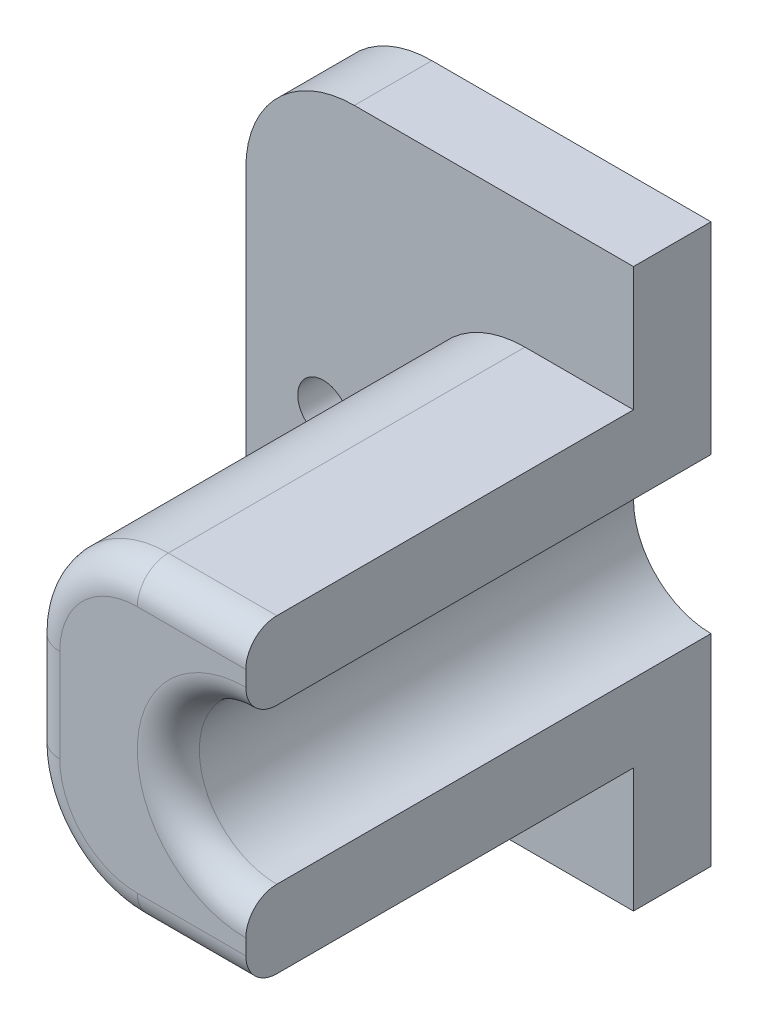
ISO-10303-21;
HEADER;
FILE_DESCRIPTION(('STEP AP214'),'2;1');
FILE_NAME('part.step','',(''),(''),'','','');
FILE_SCHEMA(('AUTOMOTIVE_DESIGN { 1 0 10303 214 1 1 1 1 }'));
ENDSEC;
DATA;
#1=APPLICATION_CONTEXT('core data for automotive mechanical design processes');
#2=APPLICATION_PROTOCOL_DEFINITION('international standard','automotive_design',2000,#1);
#3=PRODUCT_CONTEXT('',#1,'mechanical');
#4=PRODUCT('Part','Part','',(#3));
#5=PRODUCT_RELATED_PRODUCT_CATEGORY('part','',(#4));
#6=PRODUCT_DEFINITION_FORMATION('','',#4);
#7=PRODUCT_DEFINITION_CONTEXT('part definition',#1,'design');
#8=PRODUCT_DEFINITION('design','',#6,#7);
#9=PRODUCT_DEFINITION_SHAPE('','',#8);
#10=(LENGTH_UNIT() NAMED_UNIT(*) SI_UNIT(.MILLI.,.METRE.));
#11=(NAMED_UNIT(*) PLANE_ANGLE_UNIT() SI_UNIT($,.RADIAN.));
#12=(NAMED_UNIT(*) SI_UNIT($,.STERADIAN.) SOLID_ANGLE_UNIT());
#13=UNCERTAINTY_MEASURE_WITH_UNIT(LENGTH_MEASURE(1.E-05),#10,'distance_accuracy_value','');
#14=(GEOMETRIC_REPRESENTATION_CONTEXT(3) GLOBAL_UNCERTAINTY_ASSIGNED_CONTEXT((#13)) GLOBAL_UNIT_ASSIGNED_CONTEXT((#10,
#11,#12)) REPRESENTATION_CONTEXT('',''));
#15=CARTESIAN_POINT('',(0.,0.,0.));
#16=DIRECTION('',(0.,0.,1.));
#17=DIRECTION('',(1.,0.,0.));
#18=AXIS2_PLACEMENT_3D('',#15,#16,#17);
#19=CARTESIAN_POINT('',(0.,18.,5.));
#20=DIRECTION('',(-1.,0.,0.));
#21=DIRECTION('',(0.,0.,1.));
#22=AXIS2_PLACEMENT_3D('',#19,#20,#21);
#23=PLANE('',#22);
#24=DIRECTION('',(0.,0.,1.));
#25=VECTOR('',#24,1.);
#26=CARTESIAN_POINT('',(0.,-5.,-5.));
#27=LINE('',#26,#25);
#28=CARTESIAN_POINT('',(0.,-5.,0.));
#29=VERTEX_POINT('',#28);
#30=CARTESIAN_POINT('',(0.,-5.,28.));
#31=VERTEX_POINT('',#30);
#32=EDGE_CURVE('E185',#29,#31,#27,.T.);
#33=ORIENTED_EDGE('',*,*,#32,.T.);
#34=CARTESIAN_POINT('',(0.,-7.,28.));
#35=DIRECTION('',(-1.,0.,0.));
#36=DIRECTION('',(0.,0.,1.));
#37=AXIS2_PLACEMENT_3D('',#34,#35,#36);
#38=CIRCLE('',#37,2.);
#39=CARTESIAN_POINT('',(0.,-7.,30.));
#40=VERTEX_POINT('',#39);
#41=EDGE_CURVE('E269',#31,#40,#38,.F.);
#42=ORIENTED_EDGE('',*,*,#41,.T.);
#43=DIRECTION('',(0.,1.,0.));
#44=VECTOR('',#43,1.);
#45=CARTESIAN_POINT('',(0.,10.,30.));
#46=LINE('',#45,#44);
#47=CARTESIAN_POINT('',(0.,-8.,30.));
#48=VERTEX_POINT('',#47);
#49=EDGE_CURVE('E333',#48,#40,#46,.T.);
#50=ORIENTED_EDGE('',*,*,#49,.F.);
#51=CARTESIAN_POINT('',(0.,-8.,28.));
#52=DIRECTION('',(-1.,0.,0.));
#53=DIRECTION('',(0.,0.,1.));
#54=AXIS2_PLACEMENT_3D('',#51,#52,#53);
#55=CIRCLE('',#54,2.);
#56=CARTESIAN_POINT('',(0.,-10.,28.));
#57=VERTEX_POINT('',#56);
#58=EDGE_CURVE('E266',#48,#57,#55,.F.);
#59=ORIENTED_EDGE('',*,*,#58,.T.);
#60=DIRECTION('',(0.,0.,-1.));
#61=VECTOR('',#60,1.);
#62=CARTESIAN_POINT('',(0.,-10.,30.));
#63=LINE('',#62,#61);
#64=CARTESIAN_POINT('',(0.,-10.,5.));
#65=VERTEX_POINT('',#64);
#66=EDGE_CURVE('E342',#57,#65,#63,.T.);
#67=ORIENTED_EDGE('',*,*,#66,.T.);
#68=DIRECTION('',(0.,1.,0.));
#69=VECTOR('',#68,1.);
#70=CARTESIAN_POINT('',(0.,18.,5.));
#71=LINE('',#70,#69);
#72=CARTESIAN_POINT('',(0.,-18.,5.));
#73=VERTEX_POINT('',#72);
#74=EDGE_CURVE('E376',#73,#65,#71,.T.);
#75=ORIENTED_EDGE('',*,*,#74,.F.);
#76=DIRECTION('',(0.,0.,-1.));
#77=VECTOR('',#76,1.);
#78=CARTESIAN_POINT('',(0.,-18.,5.));
#79=LINE('',#78,#77);
#80=CARTESIAN_POINT('',(0.,-18.,0.));
#81=VERTEX_POINT('',#80);
#82=EDGE_CURVE('E213',#73,#81,#79,.T.);
#83=ORIENTED_EDGE('',*,*,#82,.T.);
#84=DIRECTION('',(0.,1.,0.));
#85=VECTOR('',#84,1.);
#86=CARTESIAN_POINT('',(0.,18.,0.));
#87=LINE('',#86,#85);
#88=EDGE_CURVE('E198',#81,#29,#87,.T.);
#89=ORIENTED_EDGE('',*,*,#88,.T.);
#90=EDGE_LOOP('',(#33,#42,#50,#59,#67,#75,#83,#89));
#91=FACE_BOUND('',#90,.T.);
#92=ADVANCED_FACE('F40',(#91),#23,.F.);
#93=CARTESIAN_POINT('',(0.,0.,5.));
#94=DIRECTION('',(0.,0.,1.));
#95=DIRECTION('',(1.,0.,0.));
#96=AXIS2_PLACEMENT_3D('',#93,#94,#95);
#97=PLANE('',#96);
#98=DIRECTION('',(0.,-1.,0.));
#99=VECTOR('',#98,1.);
#100=CARTESIAN_POINT('',(-25.,18.,5.));
#101=LINE('',#100,#99);
#102=CARTESIAN_POINT('',(-25.,11.,5.));
#103=VERTEX_POINT('',#102);
#104=CARTESIAN_POINT('',(-25.,-11.,5.));
#105=VERTEX_POINT('',#104);
#106=EDGE_CURVE('E209',#103,#105,#101,.T.);
#107=ORIENTED_EDGE('',*,*,#106,.T.);
#108=CARTESIAN_POINT('',(-18.,-11.,5.));
#109=DIRECTION('',(0.,0.,1.));
#110=DIRECTION('',(1.,0.,0.));
#111=AXIS2_PLACEMENT_3D('',#108,#109,#110);
#112=CIRCLE('',#111,7.);
#113=CARTESIAN_POINT('',(-18.,-18.,5.));
#114=VERTEX_POINT('',#113);
#115=EDGE_CURVE('E260',#105,#114,#112,.T.);
#116=ORIENTED_EDGE('',*,*,#115,.T.);
#117=DIRECTION('',(1.,0.,0.));
#118=VECTOR('',#117,1.);
#119=CARTESIAN_POINT('',(-25.,-18.,5.));
#120=LINE('',#119,#118);
#121=EDGE_CURVE('E372',#114,#73,#120,.T.);
#122=ORIENTED_EDGE('',*,*,#121,.T.);
#123=ORIENTED_EDGE('',*,*,#74,.T.);
#124=DIRECTION('',(1.,0.,0.));
#125=VECTOR('',#124,1.);
#126=CARTESIAN_POINT('',(-14.,-10.,5.));
#127=LINE('',#126,#125);
#128=CARTESIAN_POINT('',(-6.99999999999999,-10.,5.));
#129=VERTEX_POINT('',#128);
#130=EDGE_CURVE('E352',#129,#65,#127,.T.);
#131=ORIENTED_EDGE('',*,*,#130,.F.);
#132=CARTESIAN_POINT('',(-6.99999999999999,-3.,5.));
#133=DIRECTION('',(0.,0.,1.));
#134=DIRECTION('',(1.,0.,0.));
#135=AXIS2_PLACEMENT_3D('',#132,#133,#134);
#136=CIRCLE('',#135,7.);
#137=CARTESIAN_POINT('',(-14.,-3.,5.));
#138=VERTEX_POINT('',#137);
#139=EDGE_CURVE('E234',#129,#138,#136,.F.);
#140=ORIENTED_EDGE('',*,*,#139,.T.);
#141=DIRECTION('',(0.,-1.,0.));
#142=VECTOR('',#141,1.);
#143=CARTESIAN_POINT('',(-14.,10.,5.));
#144=LINE('',#143,#142);
#145=CARTESIAN_POINT('',(-14.,3.,5.));
#146=VERTEX_POINT('',#145);
#147=EDGE_CURVE('E348',#146,#138,#144,.T.);
#148=ORIENTED_EDGE('',*,*,#147,.F.);
#149=CARTESIAN_POINT('',(-6.99999999999999,3.,5.));
#150=DIRECTION('',(0.,0.,1.));
#151=DIRECTION('',(1.,0.,0.));
#152=AXIS2_PLACEMENT_3D('',#149,#150,#151);
#153=CIRCLE('',#152,7.);
#154=CARTESIAN_POINT('',(-6.99999999999999,10.,5.));
#155=VERTEX_POINT('',#154);
#156=EDGE_CURVE('E225',#146,#155,#153,.F.);
#157=ORIENTED_EDGE('',*,*,#156,.T.);
#158=DIRECTION('',(-1.,0.,0.));
#159=VECTOR('',#158,1.);
#160=CARTESIAN_POINT('',(-14.,10.,5.));
#161=LINE('',#160,#159);
#162=CARTESIAN_POINT('',(0.,10.,5.));
#163=VERTEX_POINT('',#162);
#164=EDGE_CURVE('E345',#163,#155,#161,.T.);
#165=ORIENTED_EDGE('',*,*,#164,.F.);
#166=CARTESIAN_POINT('',(0.,18.,5.));
#167=VERTEX_POINT('',#166);
#168=EDGE_CURVE('E375',#163,#167,#71,.T.);
#169=ORIENTED_EDGE('',*,*,#168,.T.);
#170=DIRECTION('',(-1.,0.,0.));
#171=VECTOR('',#170,1.);
#172=CARTESIAN_POINT('',(-25.,18.,5.));
#173=LINE('',#172,#171);
#174=CARTESIAN_POINT('',(-18.,18.,5.));
#175=VERTEX_POINT('',#174);
#176=EDGE_CURVE('E214',#167,#175,#173,.T.);
#177=ORIENTED_EDGE('',*,*,#176,.T.);
#178=CARTESIAN_POINT('',(-18.,11.,5.));
#179=DIRECTION('',(0.,0.,1.));
#180=DIRECTION('',(1.,0.,0.));
#181=AXIS2_PLACEMENT_3D('',#178,#179,#180);
#182=CIRCLE('',#181,7.);
#183=EDGE_CURVE('E247',#175,#103,#182,.T.);
#184=ORIENTED_EDGE('',*,*,#183,.T.);
#185=EDGE_LOOP('',(#107,#116,#122,#123,#131,#140,#148,#157,#165,#169,#177,#184));
#186=FACE_BOUND('',#185,.T.);
#187=CARTESIAN_POINT('',(-20.,0.,5.));
#188=DIRECTION('',(0.,0.,1.));
#189=DIRECTION('',(1.,0.,0.));
#190=AXIS2_PLACEMENT_3D('',#187,#188,#189);
#191=CIRCLE('',#190,1.65);
#192=CARTESIAN_POINT('',(-18.35,0.,5.));
#193=VERTEX_POINT('',#192);
#194=EDGE_CURVE('E362',#193,#193,#191,.T.);
#195=ORIENTED_EDGE('',*,*,#194,.F.);
#196=EDGE_LOOP('',(#195));
#197=FACE_BOUND('',#196,.T.);
#198=ADVANCED_FACE('F396',(#186,#197),#97,.T.);
#199=CARTESIAN_POINT('',(0.,0.,0.));
#200=DIRECTION('',(0.,0.,1.));
#201=DIRECTION('',(1.,0.,0.));
#202=AXIS2_PLACEMENT_3D('',#199,#200,#201);
#203=PLANE('',#202);
#204=DIRECTION('',(1.,0.,0.));
#205=VECTOR('',#204,1.);
#206=CARTESIAN_POINT('',(-25.,-18.,0.));
#207=LINE('',#206,#205);
#208=CARTESIAN_POINT('',(-18.,-18.,0.));
#209=VERTEX_POINT('',#208);
#210=EDGE_CURVE('E199',#209,#81,#207,.T.);
#211=ORIENTED_EDGE('',*,*,#210,.F.);
#212=CARTESIAN_POINT('',(-18.,-11.,0.));
#213=DIRECTION('',(0.,0.,1.));
#214=DIRECTION('',(1.,0.,0.));
#215=AXIS2_PLACEMENT_3D('',#212,#213,#214);
#216=CIRCLE('',#215,7.);
#217=CARTESIAN_POINT('',(-25.,-11.,0.));
#218=VERTEX_POINT('',#217);
#219=EDGE_CURVE('E254',#209,#218,#216,.F.);
#220=ORIENTED_EDGE('',*,*,#219,.T.);
#221=DIRECTION('',(0.,-1.,0.));
#222=VECTOR('',#221,1.);
#223=CARTESIAN_POINT('',(-25.,18.,0.));
#224=LINE('',#223,#222);
#225=CARTESIAN_POINT('',(-25.,11.,0.));
#226=VERTEX_POINT('',#225);
#227=EDGE_CURVE('E203',#226,#218,#224,.T.);
#228=ORIENTED_EDGE('',*,*,#227,.F.);
#229=CARTESIAN_POINT('',(-18.,11.,0.));
#230=DIRECTION('',(0.,0.,1.));
#231=DIRECTION('',(1.,0.,0.));
#232=AXIS2_PLACEMENT_3D('',#229,#230,#231);
#233=CIRCLE('',#232,7.);
#234=CARTESIAN_POINT('',(-18.,18.,0.));
#235=VERTEX_POINT('',#234);
#236=EDGE_CURVE('E241',#226,#235,#233,.F.);
#237=ORIENTED_EDGE('',*,*,#236,.T.);
#238=DIRECTION('',(-1.,0.,0.));
#239=VECTOR('',#238,1.);
#240=CARTESIAN_POINT('',(-25.,18.,0.));
#241=LINE('',#240,#239);
#242=CARTESIAN_POINT('',(0.,18.,0.));
#243=VERTEX_POINT('',#242);
#244=EDGE_CURVE('E196',#243,#235,#241,.T.);
#245=ORIENTED_EDGE('',*,*,#244,.F.);
#246=CARTESIAN_POINT('',(0.,5.,0.));
#247=VERTEX_POINT('',#246);
#248=EDGE_CURVE('E172',#247,#243,#87,.T.);
#249=ORIENTED_EDGE('',*,*,#248,.F.);
#250=CARTESIAN_POINT('',(0.,0.,0.));
#251=DIRECTION('',(0.,0.,1.));
#252=DIRECTION('',(1.,0.,0.));
#253=AXIS2_PLACEMENT_3D('',#250,#251,#252);
#254=CIRCLE('',#253,5.);
#255=EDGE_CURVE('E180',#247,#29,#254,.T.);
#256=ORIENTED_EDGE('',*,*,#255,.T.);
#257=ORIENTED_EDGE('',*,*,#88,.F.);
#258=EDGE_LOOP('',(#211,#220,#228,#237,#245,#249,#256,#257));
#259=FACE_BOUND('',#258,.T.);
#260=CARTESIAN_POINT('',(-20.,0.,0.));
#261=DIRECTION('',(0.,0.,1.));
#262=DIRECTION('',(1.,0.,0.));
#263=AXIS2_PLACEMENT_3D('',#260,#261,#262);
#264=CIRCLE('',#263,1.65);
#265=CARTESIAN_POINT('',(-18.35,0.,0.));
#266=VERTEX_POINT('',#265);
#267=EDGE_CURVE('E361',#266,#266,#264,.T.);
#268=ORIENTED_EDGE('',*,*,#267,.T.);
#269=EDGE_LOOP('',(#268));
#270=FACE_BOUND('',#269,.T.);
#271=ADVANCED_FACE('F193',(#259,#270),#203,.F.);
#272=CARTESIAN_POINT('',(-25.,18.,5.));
#273=DIRECTION('',(1.,0.,0.));
#274=DIRECTION('',(0.,0.,-1.));
#275=AXIS2_PLACEMENT_3D('',#272,#273,#274);
#276=PLANE('',#275);
#277=ORIENTED_EDGE('',*,*,#227,.T.);
#278=DIRECTION('',(0.,0.,-1.));
#279=VECTOR('',#278,1.);
#280=CARTESIAN_POINT('',(-25.,-11.,5.));
#281=LINE('',#280,#279);
#282=EDGE_CURVE('E257',#218,#105,#281,.F.);
#283=ORIENTED_EDGE('',*,*,#282,.T.);
#284=ORIENTED_EDGE('',*,*,#106,.F.);
#285=DIRECTION('',(0.,0.,-1.));
#286=VECTOR('',#285,1.);
#287=CARTESIAN_POINT('',(-25.,11.,5.));
#288=LINE('',#287,#286);
#289=EDGE_CURVE('E237',#103,#226,#288,.T.);
#290=ORIENTED_EDGE('',*,*,#289,.T.);
#291=EDGE_LOOP('',(#277,#283,#284,#290));
#292=FACE_BOUND('',#291,.T.);
#293=ADVANCED_FACE('F387',(#292),#276,.F.);
#294=CARTESIAN_POINT('',(-25.,-18.,5.));
#295=DIRECTION('',(0.,1.,0.));
#296=DIRECTION('',(0.,0.,1.));
#297=AXIS2_PLACEMENT_3D('',#294,#295,#296);
#298=PLANE('',#297);
#299=ORIENTED_EDGE('',*,*,#121,.F.);
#300=DIRECTION('',(0.,0.,-1.));
#301=VECTOR('',#300,1.);
#302=CARTESIAN_POINT('',(-18.,-18.,5.));
#303=LINE('',#302,#301);
#304=EDGE_CURVE('E250',#114,#209,#303,.T.);
#305=ORIENTED_EDGE('',*,*,#304,.T.);
#306=ORIENTED_EDGE('',*,*,#210,.T.);
#307=ORIENTED_EDGE('',*,*,#82,.F.);
#308=EDGE_LOOP('',(#299,#305,#306,#307));
#309=FACE_BOUND('',#308,.T.);
#310=ADVANCED_FACE('F400',(#309),#298,.F.);
#311=CARTESIAN_POINT('',(0.,7.,30.));
#312=VERTEX_POINT('',#311);
#313=CARTESIAN_POINT('',(0.,8.,30.));
#314=VERTEX_POINT('',#313);
#315=EDGE_CURVE('E338',#312,#314,#46,.T.);
#316=ORIENTED_EDGE('',*,*,#315,.F.);
#317=CARTESIAN_POINT('',(0.,7.,28.));
#318=DIRECTION('',(-1.,0.,0.));
#319=DIRECTION('',(0.,0.,1.));
#320=AXIS2_PLACEMENT_3D('',#317,#318,#319);
#321=CIRCLE('',#320,2.);
#322=CARTESIAN_POINT('',(0.,5.,28.));
#323=VERTEX_POINT('',#322);
#324=EDGE_CURVE('E175',#312,#323,#321,.F.);
#325=ORIENTED_EDGE('',*,*,#324,.T.);
#326=DIRECTION('',(0.,0.,1.));
#327=VECTOR('',#326,1.);
#328=CARTESIAN_POINT('',(0.,5.,-5.));
#329=LINE('',#328,#327);
#330=EDGE_CURVE('E166',#323,#247,#329,.F.);
#331=ORIENTED_EDGE('',*,*,#330,.T.);
#332=ORIENTED_EDGE('',*,*,#248,.T.);
#333=DIRECTION('',(0.,0.,-1.));
#334=VECTOR('',#333,1.);
#335=CARTESIAN_POINT('',(0.,18.,5.));
#336=LINE('',#335,#334);
#337=EDGE_CURVE('E210',#167,#243,#336,.T.);
#338=ORIENTED_EDGE('',*,*,#337,.F.);
#339=ORIENTED_EDGE('',*,*,#168,.F.);
#340=DIRECTION('',(0.,0.,-1.));
#341=VECTOR('',#340,1.);
#342=CARTESIAN_POINT('',(0.,10.,30.));
#343=LINE('',#342,#341);
#344=CARTESIAN_POINT('',(0.,10.,28.));
#345=VERTEX_POINT('',#344);
#346=EDGE_CURVE('E337',#345,#163,#343,.T.);
#347=ORIENTED_EDGE('',*,*,#346,.F.);
#348=CARTESIAN_POINT('',(0.,8.,28.));
#349=DIRECTION('',(-1.,0.,0.));
#350=DIRECTION('',(0.,0.,1.));
#351=AXIS2_PLACEMENT_3D('',#348,#349,#350);
#352=CIRCLE('',#351,2.);
#353=EDGE_CURVE('E291',#345,#314,#352,.F.);
#354=ORIENTED_EDGE('',*,*,#353,.T.);
#355=EDGE_LOOP('',(#316,#325,#331,#332,#338,#339,#347,#354));
#356=FACE_BOUND('',#355,.T.);
#357=ADVANCED_FACE('F169',(#356),#23,.F.);
#358=CARTESIAN_POINT('',(-25.,18.,5.));
#359=DIRECTION('',(0.,-1.,0.));
#360=DIRECTION('',(0.,0.,-1.));
#361=AXIS2_PLACEMENT_3D('',#358,#359,#360);
#362=PLANE('',#361);
#363=ORIENTED_EDGE('',*,*,#244,.T.);
#364=DIRECTION('',(0.,0.,-1.));
#365=VECTOR('',#364,1.);
#366=CARTESIAN_POINT('',(-18.,18.,5.));
#367=LINE('',#366,#365);
#368=EDGE_CURVE('E244',#235,#175,#367,.F.);
#369=ORIENTED_EDGE('',*,*,#368,.T.);
#370=ORIENTED_EDGE('',*,*,#176,.F.);
#371=ORIENTED_EDGE('',*,*,#337,.T.);
#372=EDGE_LOOP('',(#363,#369,#370,#371));
#373=FACE_BOUND('',#372,.T.);
#374=ADVANCED_FACE('F453',(#373),#362,.F.);
#375=CARTESIAN_POINT('',(-20.,0.,5.));
#376=DIRECTION('',(0.,0.,-1.));
#377=DIRECTION('',(-1.,0.,0.));
#378=AXIS2_PLACEMENT_3D('',#375,#376,#377);
#379=CYLINDRICAL_SURFACE('',#378,1.65);
#380=ORIENTED_EDGE('',*,*,#194,.T.);
#381=EDGE_LOOP('',(#380));
#382=FACE_BOUND('',#381,.T.);
#383=ORIENTED_EDGE('',*,*,#267,.F.);
#384=EDGE_LOOP('',(#383));
#385=FACE_BOUND('',#384,.T.);
#386=ADVANCED_FACE('F458',(#382,#385),#379,.F.);
#387=CARTESIAN_POINT('',(-14.,10.,30.));
#388=DIRECTION('',(1.,0.,0.));
#389=DIRECTION('',(0.,0.,-1.));
#390=AXIS2_PLACEMENT_3D('',#387,#388,#389);
#391=PLANE('',#390);
#392=DIRECTION('',(0.,0.,-1.));
#393=VECTOR('',#392,1.);
#394=CARTESIAN_POINT('',(-14.,-3.,30.));
#395=LINE('',#394,#393);
#396=CARTESIAN_POINT('',(-14.,-3.,28.));
#397=VERTEX_POINT('',#396);
#398=EDGE_CURVE('E231',#138,#397,#395,.F.);
#399=ORIENTED_EDGE('',*,*,#398,.T.);
#400=DIRECTION('',(0.,-1.,0.));
#401=VECTOR('',#400,1.);
#402=CARTESIAN_POINT('',(-14.,3.,28.));
#403=LINE('',#402,#401);
#404=CARTESIAN_POINT('',(-14.,3.,28.));
#405=VERTEX_POINT('',#404);
#406=EDGE_CURVE('E302',#397,#405,#403,.F.);
#407=ORIENTED_EDGE('',*,*,#406,.T.);
#408=DIRECTION('',(0.,0.,-1.));
#409=VECTOR('',#408,1.);
#410=CARTESIAN_POINT('',(-14.,3.,30.));
#411=LINE('',#410,#409);
#412=EDGE_CURVE('E218',#405,#146,#411,.T.);
#413=ORIENTED_EDGE('',*,*,#412,.T.);
#414=ORIENTED_EDGE('',*,*,#147,.T.);
#415=EDGE_LOOP('',(#399,#407,#413,#414));
#416=FACE_BOUND('',#415,.T.);
#417=ADVANCED_FACE('F408',(#416),#391,.F.);
#418=CARTESIAN_POINT('',(-14.,-10.,30.));
#419=DIRECTION('',(0.,1.,0.));
#420=DIRECTION('',(-1.,0.,0.));
#421=AXIS2_PLACEMENT_3D('',#418,#419,#420);
#422=PLANE('',#421);
#423=ORIENTED_EDGE('',*,*,#66,.F.);
#424=DIRECTION('',(1.,0.,0.));
#425=VECTOR('',#424,1.);
#426=CARTESIAN_POINT('',(-6.99999999999999,-10.,28.));
#427=LINE('',#426,#425);
#428=CARTESIAN_POINT('',(-6.99999999999999,-10.,28.));
#429=VERTEX_POINT('',#428);
#430=EDGE_CURVE('E11',#57,#429,#427,.F.);
#431=ORIENTED_EDGE('',*,*,#430,.T.);
#432=DIRECTION('',(0.,0.,-1.));
#433=VECTOR('',#432,1.);
#434=CARTESIAN_POINT('',(-6.99999999999999,-10.,30.));
#435=LINE('',#434,#433);
#436=EDGE_CURVE('E228',#429,#129,#435,.T.);
#437=ORIENTED_EDGE('',*,*,#436,.T.);
#438=ORIENTED_EDGE('',*,*,#130,.T.);
#439=EDGE_LOOP('',(#423,#431,#437,#438));
#440=FACE_BOUND('',#439,.T.);
#441=ADVANCED_FACE('F405',(#440),#422,.F.);
#442=CARTESIAN_POINT('',(-14.,10.,30.));
#443=DIRECTION('',(0.,-1.,0.));
#444=DIRECTION('',(1.,0.,0.));
#445=AXIS2_PLACEMENT_3D('',#442,#443,#444);
#446=PLANE('',#445);
#447=DIRECTION('',(0.,0.,-1.));
#448=VECTOR('',#447,1.);
#449=CARTESIAN_POINT('',(-6.99999999999999,10.,30.));
#450=LINE('',#449,#448);
#451=CARTESIAN_POINT('',(-6.99999999999999,10.,28.));
#452=VERTEX_POINT('',#451);
#453=EDGE_CURVE('E221',#155,#452,#450,.F.);
#454=ORIENTED_EDGE('',*,*,#453,.T.);
#455=DIRECTION('',(-1.,0.,0.));
#456=VECTOR('',#455,1.);
#457=CARTESIAN_POINT('',(0.,10.,28.));
#458=LINE('',#457,#456);
#459=EDGE_CURVE('E296',#452,#345,#458,.F.);
#460=ORIENTED_EDGE('',*,*,#459,.T.);
#461=ORIENTED_EDGE('',*,*,#346,.T.);
#462=ORIENTED_EDGE('',*,*,#164,.T.);
#463=EDGE_LOOP('',(#454,#460,#461,#462));
#464=FACE_BOUND('',#463,.T.);
#465=ADVANCED_FACE('F423',(#464),#446,.F.);
#466=CARTESIAN_POINT('',(0.,0.,30.));
#467=DIRECTION('',(0.,0.,1.));
#468=DIRECTION('',(1.,0.,0.));
#469=AXIS2_PLACEMENT_3D('',#466,#467,#468);
#470=PLANE('',#469);
#471=ORIENTED_EDGE('',*,*,#49,.T.);
#472=CARTESIAN_POINT('',(0.,0.,30.));
#473=DIRECTION('',(0.,0.,1.));
#474=DIRECTION('',(1.,0.,0.));
#475=AXIS2_PLACEMENT_3D('',#472,#473,#474);
#476=CIRCLE('',#475,7.);
#477=EDGE_CURVE('E288',#40,#312,#476,.F.);
#478=ORIENTED_EDGE('',*,*,#477,.T.);
#479=ORIENTED_EDGE('',*,*,#315,.T.);
#480=DIRECTION('',(-1.,0.,0.));
#481=VECTOR('',#480,1.);
#482=CARTESIAN_POINT('',(-6.99999999999999,8.,30.));
#483=LINE('',#482,#481);
#484=CARTESIAN_POINT('',(-6.99999999999999,8.,30.));
#485=VERTEX_POINT('',#484);
#486=EDGE_CURVE('E284',#314,#485,#483,.T.);
#487=ORIENTED_EDGE('',*,*,#486,.T.);
#488=CARTESIAN_POINT('',(-6.99999999999999,3.,30.));
#489=DIRECTION('',(0.,0.,1.));
#490=DIRECTION('',(1.,0.,0.));
#491=AXIS2_PLACEMENT_3D('',#488,#489,#490);
#492=CIRCLE('',#491,5.);
#493=CARTESIAN_POINT('',(-12.,3.,30.));
#494=VERTEX_POINT('',#493);
#495=EDGE_CURVE('E281',#485,#494,#492,.T.);
#496=ORIENTED_EDGE('',*,*,#495,.T.);
#497=DIRECTION('',(0.,-1.,0.));
#498=VECTOR('',#497,1.);
#499=CARTESIAN_POINT('',(-12.,-3.,30.));
#500=LINE('',#499,#498);
#501=CARTESIAN_POINT('',(-12.,-3.,30.));
#502=VERTEX_POINT('',#501);
#503=EDGE_CURVE('E278',#494,#502,#500,.T.);
#504=ORIENTED_EDGE('',*,*,#503,.T.);
#505=CARTESIAN_POINT('',(-6.99999999999999,-3.,30.));
#506=DIRECTION('',(0.,0.,1.));
#507=DIRECTION('',(1.,0.,0.));
#508=AXIS2_PLACEMENT_3D('',#505,#506,#507);
#509=CIRCLE('',#508,5.);
#510=CARTESIAN_POINT('',(-6.99999999999999,-8.,30.));
#511=VERTEX_POINT('',#510);
#512=EDGE_CURVE('E275',#502,#511,#509,.T.);
#513=ORIENTED_EDGE('',*,*,#512,.T.);
#514=DIRECTION('',(1.,0.,0.));
#515=VECTOR('',#514,1.);
#516=CARTESIAN_POINT('',(0.,-8.,30.));
#517=LINE('',#516,#515);
#518=EDGE_CURVE('E272',#511,#48,#517,.T.);
#519=ORIENTED_EDGE('',*,*,#518,.T.);
#520=EDGE_LOOP('',(#471,#478,#479,#487,#496,#504,#513,#519));
#521=FACE_BOUND('',#520,.T.);
#522=ADVANCED_FACE('F332',(#521),#470,.T.);
#523=CARTESIAN_POINT('',(0.,0.,-5.));
#524=DIRECTION('',(0.,0.,1.));
#525=DIRECTION('',(1.,0.,0.));
#526=AXIS2_PLACEMENT_3D('',#523,#524,#525);
#527=CYLINDRICAL_SURFACE('',#526,5.);
#528=ORIENTED_EDGE('',*,*,#330,.F.);
#529=CARTESIAN_POINT('',(0.,0.,28.));
#530=DIRECTION('',(0.,0.,1.));
#531=DIRECTION('',(1.,0.,0.));
#532=AXIS2_PLACEMENT_3D('',#529,#530,#531);
#533=CIRCLE('',#532,5.);
#534=EDGE_CURVE('E263',#323,#31,#533,.T.);
#535=ORIENTED_EDGE('',*,*,#534,.T.);
#536=ORIENTED_EDGE('',*,*,#32,.F.);
#537=ORIENTED_EDGE('',*,*,#255,.F.);
#538=EDGE_LOOP('',(#528,#535,#536,#537));
#539=FACE_BOUND('',#538,.T.);
#540=ADVANCED_FACE('F183',(#539),#527,.F.);
#541=CARTESIAN_POINT('',(-6.99999999999999,3.,30.));
#542=DIRECTION('',(0.,0.,-1.));
#543=DIRECTION('',(-1.,0.,0.));
#544=AXIS2_PLACEMENT_3D('',#541,#542,#543);
#545=CYLINDRICAL_SURFACE('',#544,7.);
#546=ORIENTED_EDGE('',*,*,#412,.F.);
#547=CARTESIAN_POINT('',(-6.99999999999999,3.,28.));
#548=DIRECTION('',(0.,0.,1.));
#549=DIRECTION('',(1.,0.,0.));
#550=AXIS2_PLACEMENT_3D('',#547,#548,#549);
#551=CIRCLE('',#550,7.);
#552=EDGE_CURVE('E299',#405,#452,#551,.F.);
#553=ORIENTED_EDGE('',*,*,#552,.T.);
#554=ORIENTED_EDGE('',*,*,#453,.F.);
#555=ORIENTED_EDGE('',*,*,#156,.F.);
#556=EDGE_LOOP('',(#546,#553,#554,#555));
#557=FACE_BOUND('',#556,.T.);
#558=ADVANCED_FACE('F419',(#557),#545,.T.);
#559=CARTESIAN_POINT('',(-6.99999999999999,-3.,30.));
#560=DIRECTION('',(0.,0.,-1.));
#561=DIRECTION('',(-1.,0.,0.));
#562=AXIS2_PLACEMENT_3D('',#559,#560,#561);
#563=CYLINDRICAL_SURFACE('',#562,7.);
#564=ORIENTED_EDGE('',*,*,#436,.F.);
#565=CARTESIAN_POINT('',(-6.99999999999999,-3.,28.));
#566=DIRECTION('',(0.,0.,1.));
#567=DIRECTION('',(1.,0.,0.));
#568=AXIS2_PLACEMENT_3D('',#565,#566,#567);
#569=CIRCLE('',#568,7.);
#570=EDGE_CURVE('E50',#429,#397,#569,.F.);
#571=ORIENTED_EDGE('',*,*,#570,.T.);
#572=ORIENTED_EDGE('',*,*,#398,.F.);
#573=ORIENTED_EDGE('',*,*,#139,.F.);
#574=EDGE_LOOP('',(#564,#571,#572,#573));
#575=FACE_BOUND('',#574,.T.);
#576=ADVANCED_FACE('F406',(#575),#563,.T.);
#577=CARTESIAN_POINT('',(-18.,11.,5.));
#578=DIRECTION('',(0.,0.,-1.));
#579=DIRECTION('',(-1.,0.,0.));
#580=AXIS2_PLACEMENT_3D('',#577,#578,#579);
#581=CYLINDRICAL_SURFACE('',#580,7.);
#582=ORIENTED_EDGE('',*,*,#183,.F.);
#583=ORIENTED_EDGE('',*,*,#368,.F.);
#584=ORIENTED_EDGE('',*,*,#236,.F.);
#585=ORIENTED_EDGE('',*,*,#289,.F.);
#586=EDGE_LOOP('',(#582,#583,#584,#585));
#587=FACE_BOUND('',#586,.T.);
#588=ADVANCED_FACE('F440',(#587),#581,.T.);
#589=CARTESIAN_POINT('',(-18.,-11.,5.));
#590=DIRECTION('',(0.,0.,-1.));
#591=DIRECTION('',(-1.,0.,0.));
#592=AXIS2_PLACEMENT_3D('',#589,#590,#591);
#593=CYLINDRICAL_SURFACE('',#592,7.);
#594=ORIENTED_EDGE('',*,*,#115,.F.);
#595=ORIENTED_EDGE('',*,*,#282,.F.);
#596=ORIENTED_EDGE('',*,*,#219,.F.);
#597=ORIENTED_EDGE('',*,*,#304,.F.);
#598=EDGE_LOOP('',(#594,#595,#596,#597));
#599=FACE_BOUND('',#598,.T.);
#600=ADVANCED_FACE('F392',(#599),#593,.T.);
#601=CARTESIAN_POINT('',(0.,0.,28.));
#602=DIRECTION('',(0.,0.,1.));
#603=DIRECTION('',(1.,0.,0.));
#604=AXIS2_PLACEMENT_3D('',#601,#602,#603);
#605=TOROIDAL_SURFACE('',#604,7.,2.);
#606=ORIENTED_EDGE('',*,*,#324,.F.);
#607=ORIENTED_EDGE('',*,*,#477,.F.);
#608=ORIENTED_EDGE('',*,*,#41,.F.);
#609=ORIENTED_EDGE('',*,*,#534,.F.);
#610=EDGE_LOOP('',(#606,#607,#608,#609));
#611=FACE_BOUND('',#610,.T.);
#612=ADVANCED_FACE('F432',(#611),#605,.T.);
#613=CARTESIAN_POINT('',(0.,-8.,28.));
#614=DIRECTION('',(-1.,0.,0.));
#615=DIRECTION('',(0.,-1.,0.));
#616=AXIS2_PLACEMENT_3D('',#613,#614,#615);
#617=CYLINDRICAL_SURFACE('',#616,2.);
#618=ORIENTED_EDGE('',*,*,#58,.F.);
#619=ORIENTED_EDGE('',*,*,#518,.F.);
#620=CARTESIAN_POINT('',(-6.99999999999999,-8.,28.));
#621=DIRECTION('',(-1.,0.,0.));
#622=DIRECTION('',(0.,0.,1.));
#623=AXIS2_PLACEMENT_3D('',#620,#621,#622);
#624=CIRCLE('',#623,2.);
#625=EDGE_CURVE('E44',#429,#511,#624,.T.);
#626=ORIENTED_EDGE('',*,*,#625,.F.);
#627=ORIENTED_EDGE('',*,*,#430,.F.);
#628=EDGE_LOOP('',(#618,#619,#626,#627));
#629=FACE_BOUND('',#628,.T.);
#630=ADVANCED_FACE('F42',(#629),#617,.T.);
#631=CARTESIAN_POINT('',(-6.99999999999999,-3.,28.));
#632=DIRECTION('',(0.,0.,1.));
#633=DIRECTION('',(1.,0.,0.));
#634=AXIS2_PLACEMENT_3D('',#631,#632,#633);
#635=TOROIDAL_SURFACE('',#634,5.,2.);
#636=ORIENTED_EDGE('',*,*,#625,.T.);
#637=ORIENTED_EDGE('',*,*,#512,.F.);
#638=CARTESIAN_POINT('',(-12.,-3.,28.));
#639=DIRECTION('',(0.,1.,0.));
#640=DIRECTION('',(0.,0.,1.));
#641=AXIS2_PLACEMENT_3D('',#638,#639,#640);
#642=CIRCLE('',#641,2.);
#643=EDGE_CURVE('E313',#397,#502,#642,.T.);
#644=ORIENTED_EDGE('',*,*,#643,.F.);
#645=ORIENTED_EDGE('',*,*,#570,.F.);
#646=EDGE_LOOP('',(#636,#637,#644,#645));
#647=FACE_BOUND('',#646,.T.);
#648=ADVANCED_FACE('F325',(#647),#635,.T.);
#649=CARTESIAN_POINT('',(-12.,0.,28.));
#650=DIRECTION('',(0.,1.,0.));
#651=DIRECTION('',(0.,0.,1.));
#652=AXIS2_PLACEMENT_3D('',#649,#650,#651);
#653=CYLINDRICAL_SURFACE('',#652,2.);
#654=ORIENTED_EDGE('',*,*,#643,.T.);
#655=ORIENTED_EDGE('',*,*,#503,.F.);
#656=CARTESIAN_POINT('',(-12.,3.,28.));
#657=DIRECTION('',(0.,1.,0.));
#658=DIRECTION('',(0.,0.,1.));
#659=AXIS2_PLACEMENT_3D('',#656,#657,#658);
#660=CIRCLE('',#659,2.);
#661=EDGE_CURVE('E310',#405,#494,#660,.T.);
#662=ORIENTED_EDGE('',*,*,#661,.F.);
#663=ORIENTED_EDGE('',*,*,#406,.F.);
#664=EDGE_LOOP('',(#654,#655,#662,#663));
#665=FACE_BOUND('',#664,.T.);
#666=ADVANCED_FACE('F411',(#665),#653,.T.);
#667=CARTESIAN_POINT('',(-6.99999999999999,3.,28.));
#668=DIRECTION('',(0.,0.,1.));
#669=DIRECTION('',(1.,0.,0.));
#670=AXIS2_PLACEMENT_3D('',#667,#668,#669);
#671=TOROIDAL_SURFACE('',#670,5.,2.);
#672=ORIENTED_EDGE('',*,*,#661,.T.);
#673=ORIENTED_EDGE('',*,*,#495,.F.);
#674=CARTESIAN_POINT('',(-6.99999999999999,8.,28.));
#675=DIRECTION('',(1.,0.,0.));
#676=DIRECTION('',(0.,0.,-1.));
#677=AXIS2_PLACEMENT_3D('',#674,#675,#676);
#678=CIRCLE('',#677,2.);
#679=EDGE_CURVE('E307',#452,#485,#678,.T.);
#680=ORIENTED_EDGE('',*,*,#679,.F.);
#681=ORIENTED_EDGE('',*,*,#552,.F.);
#682=EDGE_LOOP('',(#672,#673,#680,#681));
#683=FACE_BOUND('',#682,.T.);
#684=ADVANCED_FACE('F416',(#683),#671,.T.);
#685=CARTESIAN_POINT('',(0.,8.,28.));
#686=DIRECTION('',(1.,0.,0.));
#687=DIRECTION('',(0.,1.,0.));
#688=AXIS2_PLACEMENT_3D('',#685,#686,#687);
#689=CYLINDRICAL_SURFACE('',#688,2.);
#690=ORIENTED_EDGE('',*,*,#353,.F.);
#691=ORIENTED_EDGE('',*,*,#459,.F.);
#692=ORIENTED_EDGE('',*,*,#679,.T.);
#693=ORIENTED_EDGE('',*,*,#486,.F.);
#694=EDGE_LOOP('',(#690,#691,#692,#693));
#695=FACE_BOUND('',#694,.T.);
#696=ADVANCED_FACE('F428',(#695),#689,.T.);
#697=CLOSED_SHELL('',(#92,#198,#271,#293,#310,#357,#374,#386,#417,#441,#465,#522,#540,#558,#576,
#588,#600,#612,#630,#648,#666,#684,#696));
#698=MANIFOLD_SOLID_BREP('B2',#697);
#699=ADVANCED_BREP_SHAPE_REPRESENTATION('',(#18,#698),#14);
#700=SHAPE_DEFINITION_REPRESENTATION(#9,#699);
ENDSEC;
END-ISO-10303-21;
